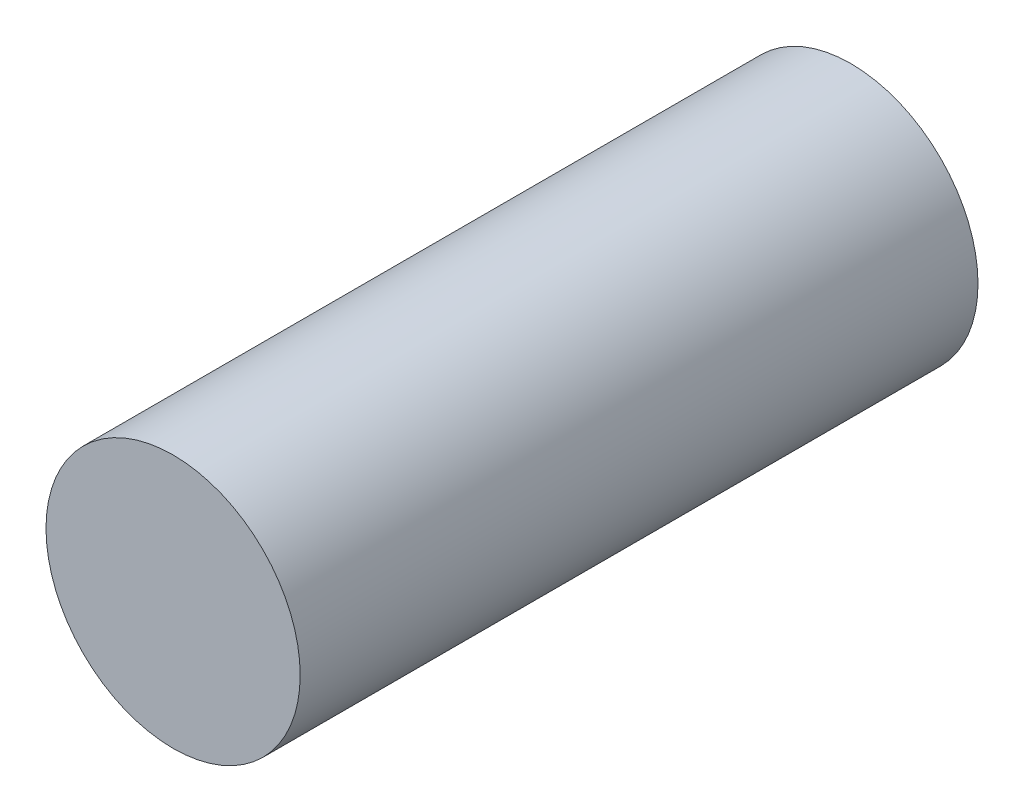
ISO-10303-21;
HEADER;
FILE_DESCRIPTION(('STEP AP214'),'2;1');
FILE_NAME('part.step','',(''),(''),'','','');
FILE_SCHEMA(('AUTOMOTIVE_DESIGN { 1 0 10303 214 1 1 1 1 }'));
ENDSEC;
DATA;
#1=APPLICATION_CONTEXT('core data for automotive mechanical design processes');
#2=APPLICATION_PROTOCOL_DEFINITION('international standard','automotive_design',2000,#1);
#3=PRODUCT_CONTEXT('',#1,'mechanical');
#4=PRODUCT('Part','Part','',(#3));
#5=PRODUCT_RELATED_PRODUCT_CATEGORY('part','',(#4));
#6=PRODUCT_DEFINITION_FORMATION('','',#4);
#7=PRODUCT_DEFINITION_CONTEXT('part definition',#1,'design');
#8=PRODUCT_DEFINITION('design','',#6,#7);
#9=PRODUCT_DEFINITION_SHAPE('','',#8);
#10=(LENGTH_UNIT() NAMED_UNIT(*) SI_UNIT(.MILLI.,.METRE.));
#11=(NAMED_UNIT(*) PLANE_ANGLE_UNIT() SI_UNIT($,.RADIAN.));
#12=(NAMED_UNIT(*) SI_UNIT($,.STERADIAN.) SOLID_ANGLE_UNIT());
#13=UNCERTAINTY_MEASURE_WITH_UNIT(LENGTH_MEASURE(1.E-05),#10,'distance_accuracy_value','');
#14=(GEOMETRIC_REPRESENTATION_CONTEXT(3) GLOBAL_UNCERTAINTY_ASSIGNED_CONTEXT((#13)) GLOBAL_UNIT_ASSIGNED_CONTEXT((#10,
#11,#12)) REPRESENTATION_CONTEXT('',''));
#15=CARTESIAN_POINT('',(0.,0.,0.));
#16=DIRECTION('',(0.,0.,1.));
#17=DIRECTION('',(1.,0.,0.));
#18=AXIS2_PLACEMENT_3D('',#15,#16,#17);
#19=CARTESIAN_POINT('',(0.,0.,16.));
#20=DIRECTION('',(0.,0.,-1.));
#21=DIRECTION('',(-1.,0.,0.));
#22=AXIS2_PLACEMENT_3D('',#19,#20,#21);
#23=CYLINDRICAL_SURFACE('',#22,3.);
#24=CARTESIAN_POINT('',(0.,0.,16.));
#25=DIRECTION('',(0.,0.,1.));
#26=DIRECTION('',(1.,0.,0.));
#27=AXIS2_PLACEMENT_3D('',#24,#25,#26);
#28=CIRCLE('',#27,3.);
#29=CARTESIAN_POINT('',(3.,0.,16.));
#30=VERTEX_POINT('',#29);
#31=EDGE_CURVE('E10',#30,#30,#28,.T.);
#32=ORIENTED_EDGE('',*,*,#31,.F.);
#33=EDGE_LOOP('',(#32));
#34=FACE_BOUND('',#33,.T.);
#35=CARTESIAN_POINT('',(0.,0.,0.));
#36=DIRECTION('',(0.,0.,1.));
#37=DIRECTION('',(1.,0.,0.));
#38=AXIS2_PLACEMENT_3D('',#35,#36,#37);
#39=CIRCLE('',#38,3.);
#40=CARTESIAN_POINT('',(3.,0.,0.));
#41=VERTEX_POINT('',#40);
#42=EDGE_CURVE('E34',#41,#41,#39,.T.);
#43=ORIENTED_EDGE('',*,*,#42,.T.);
#44=EDGE_LOOP('',(#43));
#45=FACE_BOUND('',#44,.T.);
#46=ADVANCED_FACE('F31',(#34,#45),#23,.T.);
#47=CARTESIAN_POINT('',(0.,0.,16.));
#48=DIRECTION('',(0.,0.,1.));
#49=DIRECTION('',(1.,0.,0.));
#50=AXIS2_PLACEMENT_3D('',#47,#48,#49);
#51=PLANE('',#50);
#52=ORIENTED_EDGE('',*,*,#31,.T.);
#53=EDGE_LOOP('',(#52));
#54=FACE_BOUND('',#53,.T.);
#55=ADVANCED_FACE('F46',(#54),#51,.T.);
#56=CARTESIAN_POINT('',(0.,0.,0.));
#57=DIRECTION('',(0.,0.,1.));
#58=DIRECTION('',(1.,0.,0.));
#59=AXIS2_PLACEMENT_3D('',#56,#57,#58);
#60=PLANE('',#59);
#61=ORIENTED_EDGE('',*,*,#42,.F.);
#62=EDGE_LOOP('',(#61));
#63=FACE_BOUND('',#62,.T.);
#64=ADVANCED_FACE('F44',(#63),#60,.F.);
#65=CLOSED_SHELL('',(#46,#55,#64));
#66=MANIFOLD_SOLID_BREP('B2',#65);
#67=ADVANCED_BREP_SHAPE_REPRESENTATION('',(#18,#66),#14);
#68=SHAPE_DEFINITION_REPRESENTATION(#9,#67);
ENDSEC;
END-ISO-10303-21;
